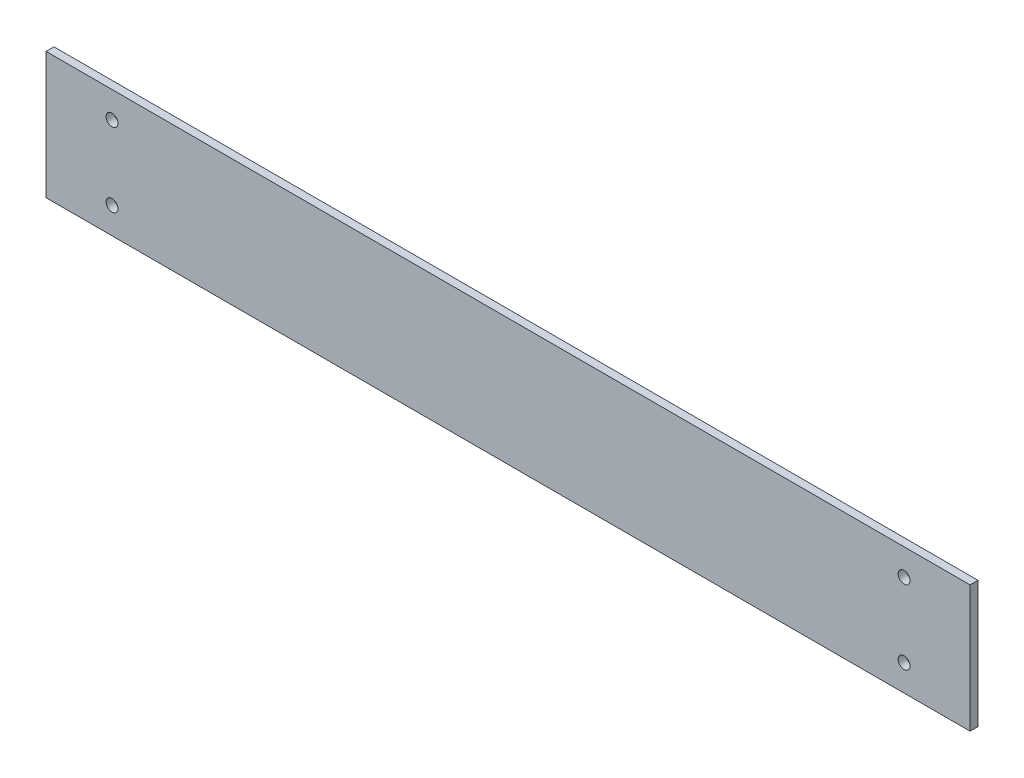
ISO-10303-21;
HEADER;
FILE_DESCRIPTION(('STEP AP214'),'2;1');
FILE_NAME('part.step','',(''),(''),'','','');
FILE_SCHEMA(('AUTOMOTIVE_DESIGN { 1 0 10303 214 1 1 1 1 }'));
ENDSEC;
DATA;
#1=APPLICATION_CONTEXT('core data for automotive mechanical design processes');
#2=APPLICATION_PROTOCOL_DEFINITION('international standard','automotive_design',2000,#1);
#3=PRODUCT_CONTEXT('',#1,'mechanical');
#4=PRODUCT('Part','Part','',(#3));
#5=PRODUCT_RELATED_PRODUCT_CATEGORY('part','',(#4));
#6=PRODUCT_DEFINITION_FORMATION('','',#4);
#7=PRODUCT_DEFINITION_CONTEXT('part definition',#1,'design');
#8=PRODUCT_DEFINITION('design','',#6,#7);
#9=PRODUCT_DEFINITION_SHAPE('','',#8);
#10=(LENGTH_UNIT() NAMED_UNIT(*) SI_UNIT(.MILLI.,.METRE.));
#11=(NAMED_UNIT(*) PLANE_ANGLE_UNIT() SI_UNIT($,.RADIAN.));
#12=(NAMED_UNIT(*) SI_UNIT($,.STERADIAN.) SOLID_ANGLE_UNIT());
#13=UNCERTAINTY_MEASURE_WITH_UNIT(LENGTH_MEASURE(1.E-05),#10,'distance_accuracy_value','');
#14=(GEOMETRIC_REPRESENTATION_CONTEXT(3) GLOBAL_UNCERTAINTY_ASSIGNED_CONTEXT((#13)) GLOBAL_UNIT_ASSIGNED_CONTEXT((#10,
#11,#12)) REPRESENTATION_CONTEXT('',''));
#15=CARTESIAN_POINT('',(0.,0.,0.));
#16=DIRECTION('',(0.,0.,1.));
#17=DIRECTION('',(1.,0.,0.));
#18=AXIS2_PLACEMENT_3D('',#15,#16,#17);
#19=CARTESIAN_POINT('',(-175.,24.,3.));
#20=DIRECTION('',(1.,0.,0.));
#21=DIRECTION('',(0.,1.,0.));
#22=AXIS2_PLACEMENT_3D('',#19,#20,#21);
#23=PLANE('',#22);
#24=DIRECTION('',(0.,-1.,0.));
#25=VECTOR('',#24,1.);
#26=CARTESIAN_POINT('',(-175.,24.,0.));
#27=LINE('',#26,#25);
#28=CARTESIAN_POINT('',(-175.,24.,0.));
#29=VERTEX_POINT('',#28);
#30=CARTESIAN_POINT('',(-175.,-24.,0.));
#31=VERTEX_POINT('',#30);
#32=EDGE_CURVE('E98',#29,#31,#27,.T.);
#33=ORIENTED_EDGE('',*,*,#32,.T.);
#34=DIRECTION('',(0.,0.,-1.));
#35=VECTOR('',#34,1.);
#36=CARTESIAN_POINT('',(-175.,-24.,3.));
#37=LINE('',#36,#35);
#38=CARTESIAN_POINT('',(-175.,-24.,3.));
#39=VERTEX_POINT('',#38);
#40=EDGE_CURVE('E11',#39,#31,#37,.T.);
#41=ORIENTED_EDGE('',*,*,#40,.F.);
#42=DIRECTION('',(0.,-1.,0.));
#43=VECTOR('',#42,1.);
#44=CARTESIAN_POINT('',(-175.,24.,3.));
#45=LINE('',#44,#43);
#46=CARTESIAN_POINT('',(-175.,24.,3.));
#47=VERTEX_POINT('',#46);
#48=EDGE_CURVE('E86',#47,#39,#45,.T.);
#49=ORIENTED_EDGE('',*,*,#48,.F.);
#50=DIRECTION('',(0.,0.,-1.));
#51=VECTOR('',#50,1.);
#52=CARTESIAN_POINT('',(-175.,24.,3.));
#53=LINE('',#52,#51);
#54=EDGE_CURVE('E94',#47,#29,#53,.T.);
#55=ORIENTED_EDGE('',*,*,#54,.T.);
#56=EDGE_LOOP('',(#33,#41,#49,#55));
#57=FACE_BOUND('',#56,.T.);
#58=ADVANCED_FACE('F35',(#57),#23,.F.);
#59=CARTESIAN_POINT('',(-175.,-24.,3.));
#60=DIRECTION('',(0.,1.,0.));
#61=DIRECTION('',(0.,0.,1.));
#62=AXIS2_PLACEMENT_3D('',#59,#60,#61);
#63=PLANE('',#62);
#64=DIRECTION('',(1.,0.,0.));
#65=VECTOR('',#64,1.);
#66=CARTESIAN_POINT('',(-175.,-24.,0.));
#67=LINE('',#66,#65);
#68=CARTESIAN_POINT('',(175.,-24.,0.));
#69=VERTEX_POINT('',#68);
#70=EDGE_CURVE('E90',#31,#69,#67,.T.);
#71=ORIENTED_EDGE('',*,*,#70,.T.);
#72=DIRECTION('',(0.,0.,-1.));
#73=VECTOR('',#72,1.);
#74=CARTESIAN_POINT('',(175.,-24.,3.));
#75=LINE('',#74,#73);
#76=CARTESIAN_POINT('',(175.,-24.,3.));
#77=VERTEX_POINT('',#76);
#78=EDGE_CURVE('E43',#77,#69,#75,.T.);
#79=ORIENTED_EDGE('',*,*,#78,.F.);
#80=DIRECTION('',(1.,0.,0.));
#81=VECTOR('',#80,1.);
#82=CARTESIAN_POINT('',(-175.,-24.,3.));
#83=LINE('',#82,#81);
#84=EDGE_CURVE('E81',#39,#77,#83,.T.);
#85=ORIENTED_EDGE('',*,*,#84,.F.);
#86=ORIENTED_EDGE('',*,*,#40,.T.);
#87=EDGE_LOOP('',(#71,#79,#85,#86));
#88=FACE_BOUND('',#87,.T.);
#89=ADVANCED_FACE('F89',(#88),#63,.F.);
#90=CARTESIAN_POINT('',(175.,24.,3.));
#91=DIRECTION('',(-1.,0.,0.));
#92=DIRECTION('',(0.,-1.,0.));
#93=AXIS2_PLACEMENT_3D('',#90,#91,#92);
#94=PLANE('',#93);
#95=DIRECTION('',(0.,1.,0.));
#96=VECTOR('',#95,1.);
#97=CARTESIAN_POINT('',(175.,24.,0.));
#98=LINE('',#97,#96);
#99=CARTESIAN_POINT('',(175.,24.,0.));
#100=VERTEX_POINT('',#99);
#101=EDGE_CURVE('E68',#69,#100,#98,.T.);
#102=ORIENTED_EDGE('',*,*,#101,.T.);
#103=DIRECTION('',(0.,0.,-1.));
#104=VECTOR('',#103,1.);
#105=CARTESIAN_POINT('',(175.,24.,3.));
#106=LINE('',#105,#104);
#107=CARTESIAN_POINT('',(175.,24.,3.));
#108=VERTEX_POINT('',#107);
#109=EDGE_CURVE('E91',#108,#100,#106,.T.);
#110=ORIENTED_EDGE('',*,*,#109,.F.);
#111=DIRECTION('',(0.,1.,0.));
#112=VECTOR('',#111,1.);
#113=CARTESIAN_POINT('',(175.,24.,3.));
#114=LINE('',#113,#112);
#115=EDGE_CURVE('E84',#77,#108,#114,.T.);
#116=ORIENTED_EDGE('',*,*,#115,.F.);
#117=ORIENTED_EDGE('',*,*,#78,.T.);
#118=EDGE_LOOP('',(#102,#110,#116,#117));
#119=FACE_BOUND('',#118,.T.);
#120=ADVANCED_FACE('F92',(#119),#94,.F.);
#121=CARTESIAN_POINT('',(-175.,24.,3.));
#122=DIRECTION('',(0.,-1.,0.));
#123=DIRECTION('',(0.,0.,-1.));
#124=AXIS2_PLACEMENT_3D('',#121,#122,#123);
#125=PLANE('',#124);
#126=DIRECTION('',(-1.,0.,0.));
#127=VECTOR('',#126,1.);
#128=CARTESIAN_POINT('',(-175.,24.,0.));
#129=LINE('',#128,#127);
#130=EDGE_CURVE('E74',#100,#29,#129,.T.);
#131=ORIENTED_EDGE('',*,*,#130,.T.);
#132=ORIENTED_EDGE('',*,*,#54,.F.);
#133=DIRECTION('',(-1.,0.,0.));
#134=VECTOR('',#133,1.);
#135=CARTESIAN_POINT('',(-175.,24.,3.));
#136=LINE('',#135,#134);
#137=EDGE_CURVE('E51',#108,#47,#136,.T.);
#138=ORIENTED_EDGE('',*,*,#137,.F.);
#139=ORIENTED_EDGE('',*,*,#109,.T.);
#140=EDGE_LOOP('',(#131,#132,#138,#139));
#141=FACE_BOUND('',#140,.T.);
#142=ADVANCED_FACE('F106',(#141),#125,.F.);
#143=CARTESIAN_POINT('',(0.,0.,3.));
#144=DIRECTION('',(0.,0.,1.));
#145=DIRECTION('',(1.,0.,0.));
#146=AXIS2_PLACEMENT_3D('',#143,#144,#145);
#147=PLANE('',#146);
#148=CARTESIAN_POINT('',(-150.,-14.,3.));
#149=DIRECTION('',(0.,0.,1.));
#150=DIRECTION('',(1.,0.,0.));
#151=AXIS2_PLACEMENT_3D('',#148,#149,#150);
#152=CIRCLE('',#151,2.25000000000001);
#153=CARTESIAN_POINT('',(-147.75,-14.,3.));
#154=VERTEX_POINT('',#153);
#155=EDGE_CURVE('E128',#154,#154,#152,.T.);
#156=ORIENTED_EDGE('',*,*,#155,.F.);
#157=EDGE_LOOP('',(#156));
#158=FACE_BOUND('',#157,.T.);
#159=CARTESIAN_POINT('',(150.,14.,3.));
#160=DIRECTION('',(0.,0.,1.));
#161=DIRECTION('',(1.,0.,0.));
#162=AXIS2_PLACEMENT_3D('',#159,#160,#161);
#163=CIRCLE('',#162,2.25000000000001);
#164=CARTESIAN_POINT('',(152.25,14.,3.));
#165=VERTEX_POINT('',#164);
#166=EDGE_CURVE('E121',#165,#165,#163,.T.);
#167=ORIENTED_EDGE('',*,*,#166,.F.);
#168=EDGE_LOOP('',(#167));
#169=FACE_BOUND('',#168,.T.);
#170=CARTESIAN_POINT('',(150.,-14.,3.));
#171=DIRECTION('',(0.,0.,1.));
#172=DIRECTION('',(1.,0.,0.));
#173=AXIS2_PLACEMENT_3D('',#170,#171,#172);
#174=CIRCLE('',#173,2.25000000000001);
#175=CARTESIAN_POINT('',(152.25,-14.,3.));
#176=VERTEX_POINT('',#175);
#177=EDGE_CURVE('E122',#176,#176,#174,.T.);
#178=ORIENTED_EDGE('',*,*,#177,.F.);
#179=EDGE_LOOP('',(#178));
#180=FACE_BOUND('',#179,.T.);
#181=CARTESIAN_POINT('',(-150.,14.,3.));
#182=DIRECTION('',(0.,0.,1.));
#183=DIRECTION('',(1.,0.,0.));
#184=AXIS2_PLACEMENT_3D('',#181,#182,#183);
#185=CIRCLE('',#184,2.25000000000001);
#186=CARTESIAN_POINT('',(-147.75,14.,3.));
#187=VERTEX_POINT('',#186);
#188=EDGE_CURVE('E114',#187,#187,#185,.T.);
#189=ORIENTED_EDGE('',*,*,#188,.F.);
#190=EDGE_LOOP('',(#189));
#191=FACE_BOUND('',#190,.T.);
#192=ORIENTED_EDGE('',*,*,#48,.T.);
#193=ORIENTED_EDGE('',*,*,#84,.T.);
#194=ORIENTED_EDGE('',*,*,#115,.T.);
#195=ORIENTED_EDGE('',*,*,#137,.T.);
#196=EDGE_LOOP('',(#192,#193,#194,#195));
#197=FACE_BOUND('',#196,.T.);
#198=ADVANCED_FACE('F82',(#158,#169,#180,#191,#197),#147,.T.);
#199=CARTESIAN_POINT('',(0.,0.,0.));
#200=DIRECTION('',(0.,0.,1.));
#201=DIRECTION('',(1.,0.,0.));
#202=AXIS2_PLACEMENT_3D('',#199,#200,#201);
#203=PLANE('',#202);
#204=CARTESIAN_POINT('',(-150.,-14.,0.));
#205=DIRECTION('',(0.,0.,1.));
#206=DIRECTION('',(1.,0.,0.));
#207=AXIS2_PLACEMENT_3D('',#204,#205,#206);
#208=CIRCLE('',#207,2.25000000000001);
#209=CARTESIAN_POINT('',(-147.75,-14.,0.));
#210=VERTEX_POINT('',#209);
#211=EDGE_CURVE('E117',#210,#210,#208,.F.);
#212=ORIENTED_EDGE('',*,*,#211,.F.);
#213=EDGE_LOOP('',(#212));
#214=FACE_BOUND('',#213,.T.);
#215=CARTESIAN_POINT('',(150.,14.,0.));
#216=DIRECTION('',(0.,0.,1.));
#217=DIRECTION('',(1.,0.,0.));
#218=AXIS2_PLACEMENT_3D('',#215,#216,#217);
#219=CIRCLE('',#218,2.25000000000001);
#220=CARTESIAN_POINT('',(152.25,14.,0.));
#221=VERTEX_POINT('',#220);
#222=EDGE_CURVE('E125',#221,#221,#219,.F.);
#223=ORIENTED_EDGE('',*,*,#222,.F.);
#224=EDGE_LOOP('',(#223));
#225=FACE_BOUND('',#224,.T.);
#226=CARTESIAN_POINT('',(150.,-14.,0.));
#227=DIRECTION('',(0.,0.,1.));
#228=DIRECTION('',(1.,0.,0.));
#229=AXIS2_PLACEMENT_3D('',#226,#227,#228);
#230=CIRCLE('',#229,2.25000000000001);
#231=CARTESIAN_POINT('',(152.25,-14.,0.));
#232=VERTEX_POINT('',#231);
#233=EDGE_CURVE('E118',#232,#232,#230,.F.);
#234=ORIENTED_EDGE('',*,*,#233,.F.);
#235=EDGE_LOOP('',(#234));
#236=FACE_BOUND('',#235,.T.);
#237=CARTESIAN_POINT('',(-150.,14.,0.));
#238=DIRECTION('',(0.,0.,1.));
#239=DIRECTION('',(1.,0.,0.));
#240=AXIS2_PLACEMENT_3D('',#237,#238,#239);
#241=CIRCLE('',#240,2.25000000000001);
#242=CARTESIAN_POINT('',(-147.75,14.,0.));
#243=VERTEX_POINT('',#242);
#244=EDGE_CURVE('E101',#243,#243,#241,.F.);
#245=ORIENTED_EDGE('',*,*,#244,.F.);
#246=EDGE_LOOP('',(#245));
#247=FACE_BOUND('',#246,.T.);
#248=ORIENTED_EDGE('',*,*,#32,.F.);
#249=ORIENTED_EDGE('',*,*,#130,.F.);
#250=ORIENTED_EDGE('',*,*,#101,.F.);
#251=ORIENTED_EDGE('',*,*,#70,.F.);
#252=EDGE_LOOP('',(#248,#249,#250,#251));
#253=FACE_BOUND('',#252,.T.);
#254=ADVANCED_FACE('F109',(#214,#225,#236,#247,#253),#203,.F.);
#255=CARTESIAN_POINT('',(-150.,14.,-0.00100000000000013));
#256=DIRECTION('',(0.,0.,1.));
#257=DIRECTION('',(1.,0.,0.));
#258=AXIS2_PLACEMENT_3D('',#255,#256,#257);
#259=CYLINDRICAL_SURFACE('',#258,2.25000000000001);
#260=CARTESIAN_POINT('',(-147.75,14.,3.));
#261=CARTESIAN_POINT('',(-147.75,14.,2.96875));
#262=CARTESIAN_POINT('',(-147.75,14.,2.9375));
#263=CARTESIAN_POINT('',(-147.75,14.,2.875));
#264=CARTESIAN_POINT('',(-147.75,14.,2.84375));
#265=CARTESIAN_POINT('',(-147.75,14.,2.78125));
#266=CARTESIAN_POINT('',(-147.75,14.,2.75));
#267=CARTESIAN_POINT('',(-147.75,14.,2.6875));
#268=CARTESIAN_POINT('',(-147.75,14.,2.65625));
#269=CARTESIAN_POINT('',(-147.75,14.,2.59375));
#270=CARTESIAN_POINT('',(-147.75,14.,2.5625));
#271=CARTESIAN_POINT('',(-147.75,14.,2.5));
#272=CARTESIAN_POINT('',(-147.75,14.,2.46875));
#273=CARTESIAN_POINT('',(-147.75,14.,2.40625));
#274=CARTESIAN_POINT('',(-147.75,14.,2.375));
#275=CARTESIAN_POINT('',(-147.75,14.,2.3125));
#276=CARTESIAN_POINT('',(-147.75,14.,2.28125));
#277=CARTESIAN_POINT('',(-147.75,14.,2.21875));
#278=CARTESIAN_POINT('',(-147.75,14.,2.1875));
#279=CARTESIAN_POINT('',(-147.75,14.,2.125));
#280=CARTESIAN_POINT('',(-147.75,14.,2.09375));
#281=CARTESIAN_POINT('',(-147.75,14.,2.03125));
#282=CARTESIAN_POINT('',(-147.75,14.,2.));
#283=CARTESIAN_POINT('',(-147.75,14.,1.9375));
#284=CARTESIAN_POINT('',(-147.75,14.,1.90625));
#285=CARTESIAN_POINT('',(-147.75,14.,1.84375));
#286=CARTESIAN_POINT('',(-147.75,14.,1.8125));
#287=CARTESIAN_POINT('',(-147.75,14.,1.75));
#288=CARTESIAN_POINT('',(-147.75,14.,1.71875));
#289=CARTESIAN_POINT('',(-147.75,14.,1.65625));
#290=CARTESIAN_POINT('',(-147.75,14.,1.625));
#291=CARTESIAN_POINT('',(-147.75,14.,1.5625));
#292=CARTESIAN_POINT('',(-147.75,14.,1.53125));
#293=CARTESIAN_POINT('',(-147.75,14.,1.46875));
#294=CARTESIAN_POINT('',(-147.75,14.,1.4375));
#295=CARTESIAN_POINT('',(-147.75,14.,1.375));
#296=CARTESIAN_POINT('',(-147.75,14.,1.34375));
#297=CARTESIAN_POINT('',(-147.75,14.,1.28125));
#298=CARTESIAN_POINT('',(-147.75,14.,1.25));
#299=CARTESIAN_POINT('',(-147.75,14.,1.1875));
#300=CARTESIAN_POINT('',(-147.75,14.,1.15625));
#301=CARTESIAN_POINT('',(-147.75,14.,1.09375));
#302=CARTESIAN_POINT('',(-147.75,14.,1.0625));
#303=CARTESIAN_POINT('',(-147.75,14.,1.));
#304=CARTESIAN_POINT('',(-147.75,14.,0.96875));
#305=CARTESIAN_POINT('',(-147.75,14.,0.90625));
#306=CARTESIAN_POINT('',(-147.75,14.,0.875));
#307=CARTESIAN_POINT('',(-147.75,14.,0.8125));
#308=CARTESIAN_POINT('',(-147.75,14.,0.78125));
#309=CARTESIAN_POINT('',(-147.75,14.,0.71875));
#310=CARTESIAN_POINT('',(-147.75,14.,0.6875));
#311=CARTESIAN_POINT('',(-147.75,14.,0.625));
#312=CARTESIAN_POINT('',(-147.75,14.,0.59375));
#313=CARTESIAN_POINT('',(-147.75,14.,0.53125));
#314=CARTESIAN_POINT('',(-147.75,14.,0.5));
#315=CARTESIAN_POINT('',(-147.75,14.,0.4375));
#316=CARTESIAN_POINT('',(-147.75,14.,0.40625));
#317=CARTESIAN_POINT('',(-147.75,14.,0.34375));
#318=CARTESIAN_POINT('',(-147.75,14.,0.3125));
#319=CARTESIAN_POINT('',(-147.75,14.,0.25));
#320=CARTESIAN_POINT('',(-147.75,14.,0.21875));
#321=CARTESIAN_POINT('',(-147.75,14.,0.15625));
#322=CARTESIAN_POINT('',(-147.75,14.,0.125));
#323=CARTESIAN_POINT('',(-147.75,14.,0.0625000000000001));
#324=CARTESIAN_POINT('',(-147.75,14.,0.0312500000000001));
#325=CARTESIAN_POINT('',(-147.75,14.,0.));
#326=B_SPLINE_CURVE_WITH_KNOTS('',3,(#260,#261,#262,#263,#264,#265,#266,#267,#268,#269,#270,
#271,#272,#273,#274,#275,#276,#277,#278,#279,#280,#281,#282,#283,#284,#285,#286,#287,#288,#289,
#290,#291,#292,#293,#294,#295,#296,#297,#298,#299,#300,#301,#302,#303,#304,#305,#306,#307,#308,
#309,#310,#311,#312,#313,#314,#315,#316,#317,#318,#319,#320,#321,#322,#323,#324,#325),
.UNSPECIFIED.,.F.,.F.,(4,2,2,2,2,2,2,2,2,2,2,2,2,2,2,2,2,2,2,2,2,2,2,2,2,2,2,2,2,2,2,2,4),(0.,
0.0937500000000001,0.1875,0.28125,0.375,0.46875,0.5625,0.65625,0.75,0.84375,0.9375,1.03125,
1.125,1.21875,1.3125,1.40625,1.5,1.59375,1.6875,1.78125,1.875,1.96875,2.0625,2.15625,2.25,
2.34375,2.4375,2.53125,2.625,2.71875,2.8125,2.90625,3.),.UNSPECIFIED.);
#327=EDGE_CURVE('BSEAM148',#187,#243,#326,.T.);
#328=ORIENTED_EDGE('',*,*,#188,.T.);
#329=ORIENTED_EDGE('',*,*,#244,.T.);
#330=ORIENTED_EDGE('',*,*,#327,.T.);
#331=ORIENTED_EDGE('',*,*,#327,.F.);
#332=EDGE_LOOP('',(#328,#330,#329,#331));
#333=FACE_BOUND('',#332,.T.);
#334=ADVANCED_FACE('F148',(#333),#259,.F.);
#335=CARTESIAN_POINT('',(150.,-14.,-0.00100000000000013));
#336=DIRECTION('',(0.,0.,1.));
#337=DIRECTION('',(1.,0.,0.));
#338=AXIS2_PLACEMENT_3D('',#335,#336,#337);
#339=CYLINDRICAL_SURFACE('',#338,2.25000000000001);
#340=CARTESIAN_POINT('',(152.25,-14.,3.));
#341=CARTESIAN_POINT('',(152.25,-14.,2.96875));
#342=CARTESIAN_POINT('',(152.25,-14.,2.9375));
#343=CARTESIAN_POINT('',(152.25,-14.,2.875));
#344=CARTESIAN_POINT('',(152.25,-14.,2.84375));
#345=CARTESIAN_POINT('',(152.25,-14.,2.78125));
#346=CARTESIAN_POINT('',(152.25,-14.,2.75));
#347=CARTESIAN_POINT('',(152.25,-14.,2.6875));
#348=CARTESIAN_POINT('',(152.25,-14.,2.65625));
#349=CARTESIAN_POINT('',(152.25,-14.,2.59375));
#350=CARTESIAN_POINT('',(152.25,-14.,2.5625));
#351=CARTESIAN_POINT('',(152.25,-14.,2.5));
#352=CARTESIAN_POINT('',(152.25,-14.,2.46875));
#353=CARTESIAN_POINT('',(152.25,-14.,2.40625));
#354=CARTESIAN_POINT('',(152.25,-14.,2.375));
#355=CARTESIAN_POINT('',(152.25,-14.,2.3125));
#356=CARTESIAN_POINT('',(152.25,-14.,2.28125));
#357=CARTESIAN_POINT('',(152.25,-14.,2.21875));
#358=CARTESIAN_POINT('',(152.25,-14.,2.1875));
#359=CARTESIAN_POINT('',(152.25,-14.,2.125));
#360=CARTESIAN_POINT('',(152.25,-14.,2.09375));
#361=CARTESIAN_POINT('',(152.25,-14.,2.03125));
#362=CARTESIAN_POINT('',(152.25,-14.,2.));
#363=CARTESIAN_POINT('',(152.25,-14.,1.9375));
#364=CARTESIAN_POINT('',(152.25,-14.,1.90625));
#365=CARTESIAN_POINT('',(152.25,-14.,1.84375));
#366=CARTESIAN_POINT('',(152.25,-14.,1.8125));
#367=CARTESIAN_POINT('',(152.25,-14.,1.75));
#368=CARTESIAN_POINT('',(152.25,-14.,1.71875));
#369=CARTESIAN_POINT('',(152.25,-14.,1.65625));
#370=CARTESIAN_POINT('',(152.25,-14.,1.625));
#371=CARTESIAN_POINT('',(152.25,-14.,1.5625));
#372=CARTESIAN_POINT('',(152.25,-14.,1.53125));
#373=CARTESIAN_POINT('',(152.25,-14.,1.46875));
#374=CARTESIAN_POINT('',(152.25,-14.,1.4375));
#375=CARTESIAN_POINT('',(152.25,-14.,1.375));
#376=CARTESIAN_POINT('',(152.25,-14.,1.34375));
#377=CARTESIAN_POINT('',(152.25,-14.,1.28125));
#378=CARTESIAN_POINT('',(152.25,-14.,1.25));
#379=CARTESIAN_POINT('',(152.25,-14.,1.1875));
#380=CARTESIAN_POINT('',(152.25,-14.,1.15625));
#381=CARTESIAN_POINT('',(152.25,-14.,1.09375));
#382=CARTESIAN_POINT('',(152.25,-14.,1.0625));
#383=CARTESIAN_POINT('',(152.25,-14.,1.));
#384=CARTESIAN_POINT('',(152.25,-14.,0.96875));
#385=CARTESIAN_POINT('',(152.25,-14.,0.90625));
#386=CARTESIAN_POINT('',(152.25,-14.,0.875));
#387=CARTESIAN_POINT('',(152.25,-14.,0.8125));
#388=CARTESIAN_POINT('',(152.25,-14.,0.78125));
#389=CARTESIAN_POINT('',(152.25,-14.,0.71875));
#390=CARTESIAN_POINT('',(152.25,-14.,0.6875));
#391=CARTESIAN_POINT('',(152.25,-14.,0.625));
#392=CARTESIAN_POINT('',(152.25,-14.,0.59375));
#393=CARTESIAN_POINT('',(152.25,-14.,0.53125));
#394=CARTESIAN_POINT('',(152.25,-14.,0.5));
#395=CARTESIAN_POINT('',(152.25,-14.,0.4375));
#396=CARTESIAN_POINT('',(152.25,-14.,0.40625));
#397=CARTESIAN_POINT('',(152.25,-14.,0.34375));
#398=CARTESIAN_POINT('',(152.25,-14.,0.3125));
#399=CARTESIAN_POINT('',(152.25,-14.,0.25));
#400=CARTESIAN_POINT('',(152.25,-14.,0.21875));
#401=CARTESIAN_POINT('',(152.25,-14.,0.15625));
#402=CARTESIAN_POINT('',(152.25,-14.,0.125));
#403=CARTESIAN_POINT('',(152.25,-14.,0.0625000000000001));
#404=CARTESIAN_POINT('',(152.25,-14.,0.0312500000000001));
#405=CARTESIAN_POINT('',(152.25,-14.,0.));
#406=B_SPLINE_CURVE_WITH_KNOTS('',3,(#340,#341,#342,#343,#344,#345,#346,#347,#348,#349,#350,
#351,#352,#353,#354,#355,#356,#357,#358,#359,#360,#361,#362,#363,#364,#365,#366,#367,#368,#369,
#370,#371,#372,#373,#374,#375,#376,#377,#378,#379,#380,#381,#382,#383,#384,#385,#386,#387,#388,
#389,#390,#391,#392,#393,#394,#395,#396,#397,#398,#399,#400,#401,#402,#403,#404,#405),
.UNSPECIFIED.,.F.,.F.,(4,2,2,2,2,2,2,2,2,2,2,2,2,2,2,2,2,2,2,2,2,2,2,2,2,2,2,2,2,2,2,2,4),(0.,
0.0937500000000001,0.1875,0.28125,0.375,0.46875,0.5625,0.65625,0.75,0.84375,0.9375,1.03125,
1.125,1.21875,1.3125,1.40625,1.5,1.59375,1.6875,1.78125,1.875,1.96875,2.0625,2.15625,2.25,
2.34375,2.4375,2.53125,2.625,2.71875,2.8125,2.90625,3.),.UNSPECIFIED.);
#407=EDGE_CURVE('BSEAM151',#176,#232,#406,.T.);
#408=ORIENTED_EDGE('',*,*,#177,.T.);
#409=ORIENTED_EDGE('',*,*,#233,.T.);
#410=ORIENTED_EDGE('',*,*,#407,.T.);
#411=ORIENTED_EDGE('',*,*,#407,.F.);
#412=EDGE_LOOP('',(#408,#410,#409,#411));
#413=FACE_BOUND('',#412,.T.);
#414=ADVANCED_FACE('F151',(#413),#339,.F.);
#415=CARTESIAN_POINT('',(150.,14.,-0.00100000000000013));
#416=DIRECTION('',(0.,0.,1.));
#417=DIRECTION('',(1.,0.,0.));
#418=AXIS2_PLACEMENT_3D('',#415,#416,#417);
#419=CYLINDRICAL_SURFACE('',#418,2.25000000000001);
#420=CARTESIAN_POINT('',(152.25,14.,3.));
#421=CARTESIAN_POINT('',(152.25,14.,2.96875));
#422=CARTESIAN_POINT('',(152.25,14.,2.9375));
#423=CARTESIAN_POINT('',(152.25,14.,2.875));
#424=CARTESIAN_POINT('',(152.25,14.,2.84375));
#425=CARTESIAN_POINT('',(152.25,14.,2.78125));
#426=CARTESIAN_POINT('',(152.25,14.,2.75));
#427=CARTESIAN_POINT('',(152.25,14.,2.6875));
#428=CARTESIAN_POINT('',(152.25,14.,2.65625));
#429=CARTESIAN_POINT('',(152.25,14.,2.59375));
#430=CARTESIAN_POINT('',(152.25,14.,2.5625));
#431=CARTESIAN_POINT('',(152.25,14.,2.5));
#432=CARTESIAN_POINT('',(152.25,14.,2.46875));
#433=CARTESIAN_POINT('',(152.25,14.,2.40625));
#434=CARTESIAN_POINT('',(152.25,14.,2.375));
#435=CARTESIAN_POINT('',(152.25,14.,2.3125));
#436=CARTESIAN_POINT('',(152.25,14.,2.28125));
#437=CARTESIAN_POINT('',(152.25,14.,2.21875));
#438=CARTESIAN_POINT('',(152.25,14.,2.1875));
#439=CARTESIAN_POINT('',(152.25,14.,2.125));
#440=CARTESIAN_POINT('',(152.25,14.,2.09375));
#441=CARTESIAN_POINT('',(152.25,14.,2.03125));
#442=CARTESIAN_POINT('',(152.25,14.,2.));
#443=CARTESIAN_POINT('',(152.25,14.,1.9375));
#444=CARTESIAN_POINT('',(152.25,14.,1.90625));
#445=CARTESIAN_POINT('',(152.25,14.,1.84375));
#446=CARTESIAN_POINT('',(152.25,14.,1.8125));
#447=CARTESIAN_POINT('',(152.25,14.,1.75));
#448=CARTESIAN_POINT('',(152.25,14.,1.71875));
#449=CARTESIAN_POINT('',(152.25,14.,1.65625));
#450=CARTESIAN_POINT('',(152.25,14.,1.625));
#451=CARTESIAN_POINT('',(152.25,14.,1.5625));
#452=CARTESIAN_POINT('',(152.25,14.,1.53125));
#453=CARTESIAN_POINT('',(152.25,14.,1.46875));
#454=CARTESIAN_POINT('',(152.25,14.,1.4375));
#455=CARTESIAN_POINT('',(152.25,14.,1.375));
#456=CARTESIAN_POINT('',(152.25,14.,1.34375));
#457=CARTESIAN_POINT('',(152.25,14.,1.28125));
#458=CARTESIAN_POINT('',(152.25,14.,1.25));
#459=CARTESIAN_POINT('',(152.25,14.,1.1875));
#460=CARTESIAN_POINT('',(152.25,14.,1.15625));
#461=CARTESIAN_POINT('',(152.25,14.,1.09375));
#462=CARTESIAN_POINT('',(152.25,14.,1.0625));
#463=CARTESIAN_POINT('',(152.25,14.,1.));
#464=CARTESIAN_POINT('',(152.25,14.,0.96875));
#465=CARTESIAN_POINT('',(152.25,14.,0.90625));
#466=CARTESIAN_POINT('',(152.25,14.,0.875));
#467=CARTESIAN_POINT('',(152.25,14.,0.8125));
#468=CARTESIAN_POINT('',(152.25,14.,0.78125));
#469=CARTESIAN_POINT('',(152.25,14.,0.71875));
#470=CARTESIAN_POINT('',(152.25,14.,0.6875));
#471=CARTESIAN_POINT('',(152.25,14.,0.625));
#472=CARTESIAN_POINT('',(152.25,14.,0.59375));
#473=CARTESIAN_POINT('',(152.25,14.,0.53125));
#474=CARTESIAN_POINT('',(152.25,14.,0.5));
#475=CARTESIAN_POINT('',(152.25,14.,0.4375));
#476=CARTESIAN_POINT('',(152.25,14.,0.40625));
#477=CARTESIAN_POINT('',(152.25,14.,0.34375));
#478=CARTESIAN_POINT('',(152.25,14.,0.3125));
#479=CARTESIAN_POINT('',(152.25,14.,0.25));
#480=CARTESIAN_POINT('',(152.25,14.,0.21875));
#481=CARTESIAN_POINT('',(152.25,14.,0.15625));
#482=CARTESIAN_POINT('',(152.25,14.,0.125));
#483=CARTESIAN_POINT('',(152.25,14.,0.0625000000000001));
#484=CARTESIAN_POINT('',(152.25,14.,0.0312500000000001));
#485=CARTESIAN_POINT('',(152.25,14.,0.));
#486=B_SPLINE_CURVE_WITH_KNOTS('',3,(#420,#421,#422,#423,#424,#425,#426,#427,#428,#429,#430,
#431,#432,#433,#434,#435,#436,#437,#438,#439,#440,#441,#442,#443,#444,#445,#446,#447,#448,#449,
#450,#451,#452,#453,#454,#455,#456,#457,#458,#459,#460,#461,#462,#463,#464,#465,#466,#467,#468,
#469,#470,#471,#472,#473,#474,#475,#476,#477,#478,#479,#480,#481,#482,#483,#484,#485),
.UNSPECIFIED.,.F.,.F.,(4,2,2,2,2,2,2,2,2,2,2,2,2,2,2,2,2,2,2,2,2,2,2,2,2,2,2,2,2,2,2,2,4),(0.,
0.0937500000000001,0.1875,0.28125,0.375,0.46875,0.5625,0.65625,0.75,0.84375,0.9375,1.03125,
1.125,1.21875,1.3125,1.40625,1.5,1.59375,1.6875,1.78125,1.875,1.96875,2.0625,2.15625,2.25,
2.34375,2.4375,2.53125,2.625,2.71875,2.8125,2.90625,3.),.UNSPECIFIED.);
#487=EDGE_CURVE('BSEAM199',#165,#221,#486,.T.);
#488=ORIENTED_EDGE('',*,*,#166,.T.);
#489=ORIENTED_EDGE('',*,*,#222,.T.);
#490=ORIENTED_EDGE('',*,*,#487,.T.);
#491=ORIENTED_EDGE('',*,*,#487,.F.);
#492=EDGE_LOOP('',(#488,#490,#489,#491));
#493=FACE_BOUND('',#492,.T.);
#494=ADVANCED_FACE('F199',(#493),#419,.F.);
#495=CARTESIAN_POINT('',(-150.,-14.,-0.00100000000000013));
#496=DIRECTION('',(0.,0.,1.));
#497=DIRECTION('',(1.,0.,0.));
#498=AXIS2_PLACEMENT_3D('',#495,#496,#497);
#499=CYLINDRICAL_SURFACE('',#498,2.25000000000001);
#500=CARTESIAN_POINT('',(-147.75,-14.,3.));
#501=CARTESIAN_POINT('',(-147.75,-14.,2.96875));
#502=CARTESIAN_POINT('',(-147.75,-14.,2.9375));
#503=CARTESIAN_POINT('',(-147.75,-14.,2.875));
#504=CARTESIAN_POINT('',(-147.75,-14.,2.84375));
#505=CARTESIAN_POINT('',(-147.75,-14.,2.78125));
#506=CARTESIAN_POINT('',(-147.75,-14.,2.75));
#507=CARTESIAN_POINT('',(-147.75,-14.,2.6875));
#508=CARTESIAN_POINT('',(-147.75,-14.,2.65625));
#509=CARTESIAN_POINT('',(-147.75,-14.,2.59375));
#510=CARTESIAN_POINT('',(-147.75,-14.,2.5625));
#511=CARTESIAN_POINT('',(-147.75,-14.,2.5));
#512=CARTESIAN_POINT('',(-147.75,-14.,2.46875));
#513=CARTESIAN_POINT('',(-147.75,-14.,2.40625));
#514=CARTESIAN_POINT('',(-147.75,-14.,2.375));
#515=CARTESIAN_POINT('',(-147.75,-14.,2.3125));
#516=CARTESIAN_POINT('',(-147.75,-14.,2.28125));
#517=CARTESIAN_POINT('',(-147.75,-14.,2.21875));
#518=CARTESIAN_POINT('',(-147.75,-14.,2.1875));
#519=CARTESIAN_POINT('',(-147.75,-14.,2.125));
#520=CARTESIAN_POINT('',(-147.75,-14.,2.09375));
#521=CARTESIAN_POINT('',(-147.75,-14.,2.03125));
#522=CARTESIAN_POINT('',(-147.75,-14.,2.));
#523=CARTESIAN_POINT('',(-147.75,-14.,1.9375));
#524=CARTESIAN_POINT('',(-147.75,-14.,1.90625));
#525=CARTESIAN_POINT('',(-147.75,-14.,1.84375));
#526=CARTESIAN_POINT('',(-147.75,-14.,1.8125));
#527=CARTESIAN_POINT('',(-147.75,-14.,1.75));
#528=CARTESIAN_POINT('',(-147.75,-14.,1.71875));
#529=CARTESIAN_POINT('',(-147.75,-14.,1.65625));
#530=CARTESIAN_POINT('',(-147.75,-14.,1.625));
#531=CARTESIAN_POINT('',(-147.75,-14.,1.5625));
#532=CARTESIAN_POINT('',(-147.75,-14.,1.53125));
#533=CARTESIAN_POINT('',(-147.75,-14.,1.46875));
#534=CARTESIAN_POINT('',(-147.75,-14.,1.4375));
#535=CARTESIAN_POINT('',(-147.75,-14.,1.375));
#536=CARTESIAN_POINT('',(-147.75,-14.,1.34375));
#537=CARTESIAN_POINT('',(-147.75,-14.,1.28125));
#538=CARTESIAN_POINT('',(-147.75,-14.,1.25));
#539=CARTESIAN_POINT('',(-147.75,-14.,1.1875));
#540=CARTESIAN_POINT('',(-147.75,-14.,1.15625));
#541=CARTESIAN_POINT('',(-147.75,-14.,1.09375));
#542=CARTESIAN_POINT('',(-147.75,-14.,1.0625));
#543=CARTESIAN_POINT('',(-147.75,-14.,1.));
#544=CARTESIAN_POINT('',(-147.75,-14.,0.96875));
#545=CARTESIAN_POINT('',(-147.75,-14.,0.90625));
#546=CARTESIAN_POINT('',(-147.75,-14.,0.875));
#547=CARTESIAN_POINT('',(-147.75,-14.,0.8125));
#548=CARTESIAN_POINT('',(-147.75,-14.,0.78125));
#549=CARTESIAN_POINT('',(-147.75,-14.,0.71875));
#550=CARTESIAN_POINT('',(-147.75,-14.,0.6875));
#551=CARTESIAN_POINT('',(-147.75,-14.,0.625));
#552=CARTESIAN_POINT('',(-147.75,-14.,0.59375));
#553=CARTESIAN_POINT('',(-147.75,-14.,0.53125));
#554=CARTESIAN_POINT('',(-147.75,-14.,0.5));
#555=CARTESIAN_POINT('',(-147.75,-14.,0.4375));
#556=CARTESIAN_POINT('',(-147.75,-14.,0.40625));
#557=CARTESIAN_POINT('',(-147.75,-14.,0.34375));
#558=CARTESIAN_POINT('',(-147.75,-14.,0.3125));
#559=CARTESIAN_POINT('',(-147.75,-14.,0.25));
#560=CARTESIAN_POINT('',(-147.75,-14.,0.21875));
#561=CARTESIAN_POINT('',(-147.75,-14.,0.15625));
#562=CARTESIAN_POINT('',(-147.75,-14.,0.125));
#563=CARTESIAN_POINT('',(-147.75,-14.,0.0625000000000001));
#564=CARTESIAN_POINT('',(-147.75,-14.,0.0312500000000001));
#565=CARTESIAN_POINT('',(-147.75,-14.,0.));
#566=B_SPLINE_CURVE_WITH_KNOTS('',3,(#500,#501,#502,#503,#504,#505,#506,#507,#508,#509,#510,
#511,#512,#513,#514,#515,#516,#517,#518,#519,#520,#521,#522,#523,#524,#525,#526,#527,#528,#529,
#530,#531,#532,#533,#534,#535,#536,#537,#538,#539,#540,#541,#542,#543,#544,#545,#546,#547,#548,
#549,#550,#551,#552,#553,#554,#555,#556,#557,#558,#559,#560,#561,#562,#563,#564,#565),
.UNSPECIFIED.,.F.,.F.,(4,2,2,2,2,2,2,2,2,2,2,2,2,2,2,2,2,2,2,2,2,2,2,2,2,2,2,2,2,2,2,2,4),(0.,
0.0937500000000001,0.1875,0.28125,0.375,0.46875,0.5625,0.65625,0.75,0.84375,0.9375,1.03125,
1.125,1.21875,1.3125,1.40625,1.5,1.59375,1.6875,1.78125,1.875,1.96875,2.0625,2.15625,2.25,
2.34375,2.4375,2.53125,2.625,2.71875,2.8125,2.90625,3.),.UNSPECIFIED.);
#567=EDGE_CURVE('BSEAM136',#154,#210,#566,.T.);
#568=ORIENTED_EDGE('',*,*,#155,.T.);
#569=ORIENTED_EDGE('',*,*,#211,.T.);
#570=ORIENTED_EDGE('',*,*,#567,.T.);
#571=ORIENTED_EDGE('',*,*,#567,.F.);
#572=EDGE_LOOP('',(#568,#570,#569,#571));
#573=FACE_BOUND('',#572,.T.);
#574=ADVANCED_FACE('F136',(#573),#499,.F.);
#575=CLOSED_SHELL('',(#58,#89,#120,#142,#198,#254,#334,#414,#494,#574));
#576=MANIFOLD_SOLID_BREP('B2',#575);
#577=ADVANCED_BREP_SHAPE_REPRESENTATION('',(#18,#576),#14);
#578=SHAPE_DEFINITION_REPRESENTATION(#9,#577);
ENDSEC;
END-ISO-10303-21;
